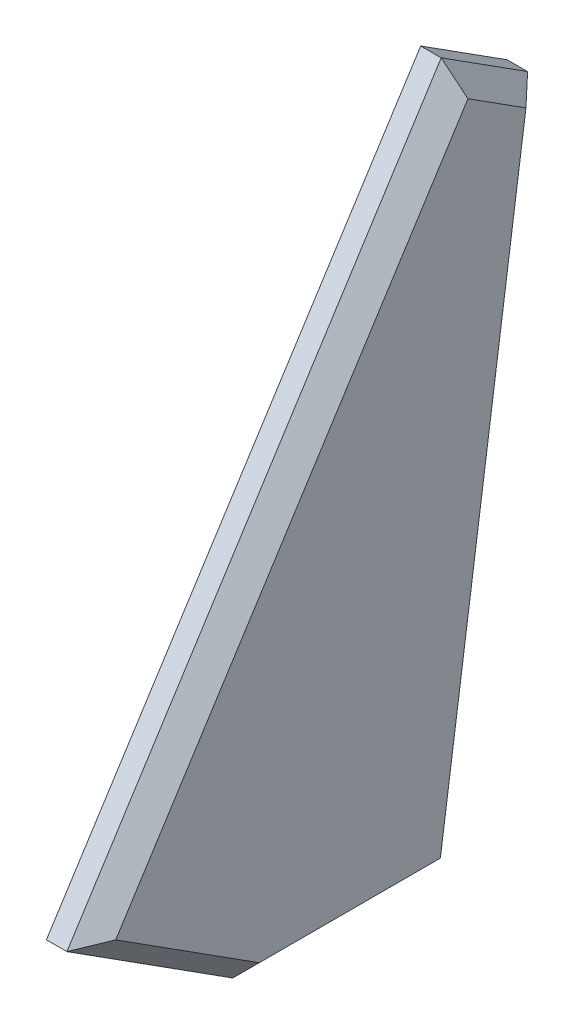
ISO-10303-21;
HEADER;
FILE_DESCRIPTION(('STEP AP214'),'2;1');
FILE_NAME('part.step','',(''),(''),'','','');
FILE_SCHEMA(('AUTOMOTIVE_DESIGN { 1 0 10303 214 1 1 1 1 }'));
ENDSEC;
DATA;
#1=APPLICATION_CONTEXT('core data for automotive mechanical design processes');
#2=APPLICATION_PROTOCOL_DEFINITION('international standard','automotive_design',2000,#1);
#3=PRODUCT_CONTEXT('',#1,'mechanical');
#4=PRODUCT('Part','Part','',(#3));
#5=PRODUCT_RELATED_PRODUCT_CATEGORY('part','',(#4));
#6=PRODUCT_DEFINITION_FORMATION('','',#4);
#7=PRODUCT_DEFINITION_CONTEXT('part definition',#1,'design');
#8=PRODUCT_DEFINITION('design','',#6,#7);
#9=PRODUCT_DEFINITION_SHAPE('','',#8);
#10=(LENGTH_UNIT() NAMED_UNIT(*) SI_UNIT(.MILLI.,.METRE.));
#11=(NAMED_UNIT(*) PLANE_ANGLE_UNIT() SI_UNIT($,.RADIAN.));
#12=(NAMED_UNIT(*) SI_UNIT($,.STERADIAN.) SOLID_ANGLE_UNIT());
#13=UNCERTAINTY_MEASURE_WITH_UNIT(LENGTH_MEASURE(1.E-05),#10,'distance_accuracy_value','');
#14=(GEOMETRIC_REPRESENTATION_CONTEXT(3) GLOBAL_UNCERTAINTY_ASSIGNED_CONTEXT((#13)) GLOBAL_UNIT_ASSIGNED_CONTEXT((#10,
#11,#12)) REPRESENTATION_CONTEXT('',''));
#15=CARTESIAN_POINT('',(0.,0.,0.));
#16=DIRECTION('',(0.,0.,1.));
#17=DIRECTION('',(1.,0.,0.));
#18=AXIS2_PLACEMENT_3D('',#15,#16,#17);
#19=CARTESIAN_POINT('',(10.,0.,0.));
#20=DIRECTION('',(-1.,0.,0.));
#21=DIRECTION('',(0.,0.,-1.));
#22=AXIS2_PLACEMENT_3D('',#19,#20,#21);
#23=PLANE('',#22);
#24=DIRECTION('',(0.,-0.537696320749716,-0.843138580929742));
#25=VECTOR('',#24,1.);
#26=CARTESIAN_POINT('',(10.,138.978102181345,-88.6307611795957));
#27=LINE('',#26,#25);
#28=CARTESIAN_POINT('',(10.,162.099043973583,-52.375802199617));
#29=VERTEX_POINT('',#28);
#30=CARTESIAN_POINT('',(10.,153.074407034999,-66.5269490238948));
#31=VERTEX_POINT('',#30);
#32=EDGE_CURVE('E58',#29,#31,#27,.T.);
#33=ORIENTED_EDGE('',*,*,#32,.F.);
#34=DIRECTION('',(0.,0.843138580929741,-0.537696320749717));
#35=VECTOR('',#34,1.);
#36=CARTESIAN_POINT('',(10.,23.1209417922378,36.2549589799789));
#37=LINE('',#36,#35);
#38=CARTESIAN_POINT('',(10.,27.3366346968866,33.5664773762303));
#39=VERTEX_POINT('',#38);
#40=EDGE_CURVE('E131',#39,#29,#37,.T.);
#41=ORIENTED_EDGE('',*,*,#40,.F.);
#42=DIRECTION('',(0.,0.537696320749717,0.843138580929741));
#43=VECTOR('',#42,1.);
#44=CARTESIAN_POINT('',(10.,4.21569290464871,-2.68848160374859));
#45=LINE('',#44,#43);
#46=CARTESIAN_POINT('',(10.,5.,-1.45864322496707));
#47=VERTEX_POINT('',#46);
#48=EDGE_CURVE('E129',#47,#39,#45,.T.);
#49=ORIENTED_EDGE('',*,*,#48,.F.);
#50=DIRECTION('',(0.,0.,1.));
#51=VECTOR('',#50,1.);
#52=CARTESIAN_POINT('',(10.,5.,0.));
#53=LINE('',#52,#51);
#54=CARTESIAN_POINT('',(10.,5.,-45.6454063089344));
#55=VERTEX_POINT('',#54);
#56=EDGE_CURVE('E105',#55,#47,#53,.T.);
#57=ORIENTED_EDGE('',*,*,#56,.F.);
#58=DIRECTION('',(0.,-0.990202485443901,0.139638955240722));
#59=VECTOR('',#58,1.);
#60=CARTESIAN_POINT('',(10.,-6.21393350821214,-44.0640106022536));
#61=LINE('',#60,#59);
#62=EDGE_CURVE('E12',#31,#55,#61,.T.);
#63=ORIENTED_EDGE('',*,*,#62,.F.);
#64=EDGE_LOOP('',(#33,#41,#49,#57,#63));
#65=FACE_BOUND('',#64,.T.);
#66=ADVANCED_FACE('F49',(#65),#23,.F.);
#67=CARTESIAN_POINT('',(5.,0.,0.));
#68=DIRECTION('',(-1.,0.,0.));
#69=DIRECTION('',(0.,0.,-1.));
#70=AXIS2_PLACEMENT_3D('',#67,#68,#69);
#71=PLANE('',#70);
#72=DIRECTION('',(0.,0.,1.));
#73=VECTOR('',#72,1.);
#74=CARTESIAN_POINT('',(5.,0.,-49.9897755536429));
#75=LINE('',#74,#73);
#76=CARTESIAN_POINT('',(5.,0.,-49.9897755536429));
#77=VERTEX_POINT('',#76);
#78=CARTESIAN_POINT('',(5.,0.,0.));
#79=VERTEX_POINT('',#78);
#80=EDGE_CURVE('E103',#77,#79,#75,.T.);
#81=ORIENTED_EDGE('',*,*,#80,.T.);
#82=DIRECTION('',(0.,0.537696320749717,0.843138580929741));
#83=VECTOR('',#82,1.);
#84=CARTESIAN_POINT('',(5.,0.,0.));
#85=LINE('',#84,#83);
#86=CARTESIAN_POINT('',(5.,25.8094233959864,40.4706518846276));
#87=VERTEX_POINT('',#86);
#88=EDGE_CURVE('E111',#79,#87,#85,.T.);
#89=ORIENTED_EDGE('',*,*,#88,.T.);
#90=DIRECTION('',(0.,0.843138580929741,-0.537696320749717));
#91=VECTOR('',#90,1.);
#92=CARTESIAN_POINT('',(5.,25.8094233959864,40.4706518846276));
#93=LINE('',#92,#91);
#94=CARTESIAN_POINT('',(5.,169.00321848198,-50.8485908987169));
#95=VERTEX_POINT('',#94);
#96=EDGE_CURVE('E116',#87,#95,#93,.T.);
#97=ORIENTED_EDGE('',*,*,#96,.T.);
#98=DIRECTION('',(0.,-0.537696320749716,-0.843138580929742));
#99=VECTOR('',#98,1.);
#100=CARTESIAN_POINT('',(5.,169.00321848198,-50.8485908987169));
#101=LINE('',#100,#99);
#102=CARTESIAN_POINT('',(5.,155.560810463237,-71.9270554219604));
#103=VERTEX_POINT('',#102);
#104=EDGE_CURVE('E125',#95,#103,#101,.T.);
#105=ORIENTED_EDGE('',*,*,#104,.T.);
#106=DIRECTION('',(0.,-0.990202485443901,0.139638955240722));
#107=VECTOR('',#106,1.);
#108=CARTESIAN_POINT('',(5.,155.560810463237,-71.9270554219604));
#109=LINE('',#108,#107);
#110=EDGE_CURVE('E121',#103,#77,#109,.T.);
#111=ORIENTED_EDGE('',*,*,#110,.T.);
#112=EDGE_LOOP('',(#81,#89,#97,#105,#111));
#113=FACE_BOUND('',#112,.T.);
#114=ADVANCED_FACE('F119',(#113),#71,.T.);
#115=CARTESIAN_POINT('',(10.,23.1209417922379,36.2549589799789));
#116=DIRECTION('',(-0.707106781186545,-0.380208714621183,-0.596189008055424));
#117=DIRECTION('',(0.,0.843138580929741,-0.537696320749717));
#118=AXIS2_PLACEMENT_3D('',#115,#116,#117);
#119=PLANE('',#118);
#120=DIRECTION('',(0.577350269189628,-0.797225402191064,-0.176347171136824));
#121=VECTOR('',#120,1.);
#122=CARTESIAN_POINT('',(64.9447446816678,86.2294228532693,-69.1582492001998));
#123=LINE('',#122,#121);
#124=EDGE_CURVE('E73',#29,#95,#123,.F.);
#125=ORIENTED_EDGE('',*,*,#124,.T.);
#126=ORIENTED_EDGE('',*,*,#96,.F.);
#127=DIRECTION('',(0.577350269189628,0.176347171136824,-0.797225402191064));
#128=VECTOR('',#127,1.);
#129=CARTESIAN_POINT('',(24.3333333333334,31.7146404261336,13.7745104521581));
#130=LINE('',#129,#128);
#131=EDGE_CURVE('E53',#87,#39,#130,.T.);
#132=ORIENTED_EDGE('',*,*,#131,.T.);
#133=ORIENTED_EDGE('',*,*,#40,.T.);
#134=EDGE_LOOP('',(#125,#126,#132,#133));
#135=FACE_BOUND('',#134,.T.);
#136=ADVANCED_FACE('F51',(#135),#119,.F.);
#137=CARTESIAN_POINT('',(10.,4.21569290464871,-2.68848160374859));
#138=DIRECTION('',(-0.707106781186545,0.596189008055424,-0.380208714621183));
#139=DIRECTION('',(0.,0.537696320749717,0.843138580929741));
#140=AXIS2_PLACEMENT_3D('',#137,#138,#139);
#141=PLANE('',#140);
#142=ORIENTED_EDGE('',*,*,#131,.F.);
#143=ORIENTED_EDGE('',*,*,#88,.F.);
#144=DIRECTION('',(0.69252582355833,0.692525823558326,-0.202029620129619));
#145=VECTOR('',#144,1.);
#146=CARTESIAN_POINT('',(9.79592016295141,4.79592016295141,-1.39910729063441));
#147=LINE('',#146,#145);
#148=EDGE_CURVE('E99',#79,#47,#147,.T.);
#149=ORIENTED_EDGE('',*,*,#148,.T.);
#150=ORIENTED_EDGE('',*,*,#48,.T.);
#151=EDGE_LOOP('',(#142,#143,#149,#150));
#152=FACE_BOUND('',#151,.T.);
#153=ADVANCED_FACE('F112',(#152),#141,.F.);
#154=CARTESIAN_POINT('',(10.,138.978102181345,-88.6307611795957));
#155=DIRECTION('',(-0.707106781186546,-0.596189008055424,0.380208714621182));
#156=DIRECTION('',(0.,-0.537696320749716,-0.843138580929742));
#157=AXIS2_PLACEMENT_3D('',#154,#155,#156);
#158=PLANE('',#157);
#159=ORIENTED_EDGE('',*,*,#124,.F.);
#160=ORIENTED_EDGE('',*,*,#32,.T.);
#161=DIRECTION('',(0.643658178645575,-0.320078780399511,0.695164529734237));
#162=VECTOR('',#161,1.);
#163=CARTESIAN_POINT('',(3.01382545322805,156.548496703671,-74.0721661975));
#164=LINE('',#163,#162);
#165=EDGE_CURVE('E65',#31,#103,#164,.F.);
#166=ORIENTED_EDGE('',*,*,#165,.T.);
#167=ORIENTED_EDGE('',*,*,#104,.F.);
#168=EDGE_LOOP('',(#159,#160,#166,#167));
#169=FACE_BOUND('',#168,.T.);
#170=ADVANCED_FACE('F139',(#169),#158,.F.);
#171=CARTESIAN_POINT('',(10.,5.,0.));
#172=DIRECTION('',(-0.707106781186545,0.707106781186549,0.));
#173=DIRECTION('',(0.,0.,1.));
#174=AXIS2_PLACEMENT_3D('',#171,#172,#173);
#175=PLANE('',#174);
#176=ORIENTED_EDGE('',*,*,#148,.F.);
#177=ORIENTED_EDGE('',*,*,#80,.F.);
#178=DIRECTION('',(-0.602481600728715,-0.602481600728712,-0.52348050734171));
#179=VECTOR('',#178,1.);
#180=CARTESIAN_POINT('',(24.3959848315547,19.3959848315546,-33.1371115590353));
#181=LINE('',#180,#179);
#182=EDGE_CURVE('E134',#77,#55,#181,.F.);
#183=ORIENTED_EDGE('',*,*,#182,.T.);
#184=ORIENTED_EDGE('',*,*,#56,.T.);
#185=EDGE_LOOP('',(#176,#177,#183,#184));
#186=FACE_BOUND('',#185,.T.);
#187=ADVANCED_FACE('F101',(#186),#175,.F.);
#188=CARTESIAN_POINT('',(10.,-6.21393350821214,-44.0640106022536));
#189=DIRECTION('',(-0.707106781186545,0.0987396521685198,0.700178892205159));
#190=DIRECTION('',(0.,-0.990202485443901,0.139638955240722));
#191=AXIS2_PLACEMENT_3D('',#188,#189,#190);
#192=PLANE('',#191);
#193=ORIENTED_EDGE('',*,*,#165,.F.);
#194=ORIENTED_EDGE('',*,*,#62,.T.);
#195=ORIENTED_EDGE('',*,*,#182,.F.);
#196=ORIENTED_EDGE('',*,*,#110,.F.);
#197=EDGE_LOOP('',(#193,#194,#195,#196));
#198=FACE_BOUND('',#197,.T.);
#199=ADVANCED_FACE('F140',(#198),#192,.F.);
#200=CLOSED_SHELL('',(#66,#114,#136,#153,#170,#187,#199));
#201=MANIFOLD_SOLID_BREP('B2',#200);
#202=CARTESIAN_POINT('',(5.,25.8094233959864,40.4706518846276));
#203=DIRECTION('',(0.,0.843138580929741,-0.537696320749717));
#204=DIRECTION('',(0.,-0.537696320749717,-0.843138580929741));
#205=AXIS2_PLACEMENT_3D('',#202,#203,#204);
#206=PLANE('',#205);
#207=DIRECTION('',(0.,0.537696320749717,0.843138580929741));
#208=VECTOR('',#207,1.);
#209=CARTESIAN_POINT('',(0.,25.8094233959864,40.4706518846276));
#210=LINE('',#209,#208);
#211=CARTESIAN_POINT('',(0.,0.,0.));
#212=VERTEX_POINT('',#211);
#213=CARTESIAN_POINT('',(0.,25.8094233959864,40.4706518846276));
#214=VERTEX_POINT('',#213);
#215=EDGE_CURVE('E274',#212,#214,#210,.T.);
#216=ORIENTED_EDGE('',*,*,#215,.F.);
#217=DIRECTION('',(-1.,0.,0.));
#218=VECTOR('',#217,1.);
#219=CARTESIAN_POINT('',(5.,0.,0.));
#220=LINE('',#219,#218);
#221=CARTESIAN_POINT('',(5.,0.,0.));
#222=VERTEX_POINT('',#221);
#223=EDGE_CURVE('E273',#222,#212,#220,.T.);
#224=ORIENTED_EDGE('',*,*,#223,.F.);
#225=DIRECTION('',(0.,0.537696320749717,0.843138580929741));
#226=VECTOR('',#225,1.);
#227=CARTESIAN_POINT('',(5.,25.8094233959864,40.4706518846276));
#228=LINE('',#227,#226);
#229=CARTESIAN_POINT('',(5.,25.8094233959864,40.4706518846276));
#230=VERTEX_POINT('',#229);
#231=EDGE_CURVE('E268',#222,#230,#228,.T.);
#232=ORIENTED_EDGE('',*,*,#231,.T.);
#233=DIRECTION('',(-1.,0.,0.));
#234=VECTOR('',#233,1.);
#235=CARTESIAN_POINT('',(5.,25.8094233959864,40.4706518846276));
#236=LINE('',#235,#234);
#237=EDGE_CURVE('E47',#230,#214,#236,.T.);
#238=ORIENTED_EDGE('',*,*,#237,.T.);
#239=EDGE_LOOP('',(#216,#224,#232,#238));
#240=FACE_BOUND('',#239,.T.);
#241=ADVANCED_FACE('F199',(#240),#206,.F.);
#242=CARTESIAN_POINT('',(5.,169.00321848198,-50.8485908987169));
#243=DIRECTION('',(0.,-0.537696320749717,-0.843138580929741));
#244=DIRECTION('',(0.,-0.843138580929741,0.537696320749717));
#245=AXIS2_PLACEMENT_3D('',#242,#243,#244);
#246=PLANE('',#245);
#247=DIRECTION('',(0.,0.843138580929741,-0.537696320749717));
#248=VECTOR('',#247,1.);
#249=CARTESIAN_POINT('',(0.,169.00321848198,-50.8485908987169));
#250=LINE('',#249,#248);
#251=CARTESIAN_POINT('',(0.,169.00321848198,-50.8485908987169));
#252=VERTEX_POINT('',#251);
#253=EDGE_CURVE('E276',#214,#252,#250,.T.);
#254=ORIENTED_EDGE('',*,*,#253,.F.);
#255=ORIENTED_EDGE('',*,*,#237,.F.);
#256=DIRECTION('',(0.,0.843138580929741,-0.537696320749717));
#257=VECTOR('',#256,1.);
#258=CARTESIAN_POINT('',(5.,169.00321848198,-50.8485908987169));
#259=LINE('',#258,#257);
#260=CARTESIAN_POINT('',(5.,169.00321848198,-50.8485908987169));
#261=VERTEX_POINT('',#260);
#262=EDGE_CURVE('E244',#230,#261,#259,.T.);
#263=ORIENTED_EDGE('',*,*,#262,.T.);
#264=DIRECTION('',(-1.,0.,0.));
#265=VECTOR('',#264,1.);
#266=CARTESIAN_POINT('',(5.,169.00321848198,-50.8485908987169));
#267=LINE('',#266,#265);
#268=EDGE_CURVE('E207',#261,#252,#267,.T.);
#269=ORIENTED_EDGE('',*,*,#268,.T.);
#270=EDGE_LOOP('',(#254,#255,#263,#269));
#271=FACE_BOUND('',#270,.T.);
#272=ADVANCED_FACE('F285',(#271),#246,.F.);
#273=CARTESIAN_POINT('',(5.,155.560810463237,-71.9270554219604));
#274=DIRECTION('',(0.,-0.843138580929742,0.537696320749716));
#275=DIRECTION('',(0.,0.537696320749716,0.843138580929742));
#276=AXIS2_PLACEMENT_3D('',#273,#274,#275);
#277=PLANE('',#276);
#278=DIRECTION('',(0.,-0.537696320749716,-0.843138580929742));
#279=VECTOR('',#278,1.);
#280=CARTESIAN_POINT('',(0.,155.560810463237,-71.9270554219604));
#281=LINE('',#280,#279);
#282=CARTESIAN_POINT('',(0.,155.560810463237,-71.9270554219604));
#283=VERTEX_POINT('',#282);
#284=EDGE_CURVE('E279',#252,#283,#281,.T.);
#285=ORIENTED_EDGE('',*,*,#284,.F.);
#286=ORIENTED_EDGE('',*,*,#268,.F.);
#287=DIRECTION('',(0.,-0.537696320749716,-0.843138580929742));
#288=VECTOR('',#287,1.);
#289=CARTESIAN_POINT('',(5.,155.560810463237,-71.9270554219604));
#290=LINE('',#289,#288);
#291=CARTESIAN_POINT('',(5.,155.560810463237,-71.9270554219604));
#292=VERTEX_POINT('',#291);
#293=EDGE_CURVE('E253',#261,#292,#290,.T.);
#294=ORIENTED_EDGE('',*,*,#293,.T.);
#295=DIRECTION('',(-1.,0.,0.));
#296=VECTOR('',#295,1.);
#297=CARTESIAN_POINT('',(5.,155.560810463237,-71.9270554219604));
#298=LINE('',#297,#296);
#299=EDGE_CURVE('E258',#292,#283,#298,.T.);
#300=ORIENTED_EDGE('',*,*,#299,.T.);
#301=EDGE_LOOP('',(#285,#286,#294,#300));
#302=FACE_BOUND('',#301,.T.);
#303=ADVANCED_FACE('F265',(#302),#277,.F.);
#304=CARTESIAN_POINT('',(5.,0.,-49.9897755536429));
#305=DIRECTION('',(0.,0.139638955240722,0.990202485443901));
#306=DIRECTION('',(0.,0.990202485443901,-0.139638955240722));
#307=AXIS2_PLACEMENT_3D('',#304,#305,#306);
#308=PLANE('',#307);
#309=DIRECTION('',(0.,-0.990202485443901,0.139638955240722));
#310=VECTOR('',#309,1.);
#311=CARTESIAN_POINT('',(0.,0.,-49.9897755536429));
#312=LINE('',#311,#310);
#313=CARTESIAN_POINT('',(0.,0.,-49.9897755536429));
#314=VERTEX_POINT('',#313);
#315=EDGE_CURVE('E260',#283,#314,#312,.T.);
#316=ORIENTED_EDGE('',*,*,#315,.F.);
#317=ORIENTED_EDGE('',*,*,#299,.F.);
#318=DIRECTION('',(0.,-0.990202485443901,0.139638955240722));
#319=VECTOR('',#318,1.);
#320=CARTESIAN_POINT('',(5.,0.,-49.9897755536429));
#321=LINE('',#320,#319);
#322=CARTESIAN_POINT('',(5.,0.,-49.9897755536429));
#323=VERTEX_POINT('',#322);
#324=EDGE_CURVE('E249',#292,#323,#321,.T.);
#325=ORIENTED_EDGE('',*,*,#324,.T.);
#326=DIRECTION('',(-1.,0.,0.));
#327=VECTOR('',#326,1.);
#328=CARTESIAN_POINT('',(5.,0.,-49.9897755536429));
#329=LINE('',#328,#327);
#330=EDGE_CURVE('E263',#323,#314,#329,.T.);
#331=ORIENTED_EDGE('',*,*,#330,.T.);
#332=EDGE_LOOP('',(#316,#317,#325,#331));
#333=FACE_BOUND('',#332,.T.);
#334=ADVANCED_FACE('F259',(#333),#308,.F.);
#335=CARTESIAN_POINT('',(5.,0.,0.));
#336=DIRECTION('',(0.,1.,0.));
#337=DIRECTION('',(0.,0.,-1.));
#338=AXIS2_PLACEMENT_3D('',#335,#336,#337);
#339=PLANE('',#338);
#340=DIRECTION('',(0.,0.,1.));
#341=VECTOR('',#340,1.);
#342=CARTESIAN_POINT('',(0.,0.,0.));
#343=LINE('',#342,#341);
#344=EDGE_CURVE('E232',#314,#212,#343,.T.);
#345=ORIENTED_EDGE('',*,*,#344,.F.);
#346=ORIENTED_EDGE('',*,*,#330,.F.);
#347=DIRECTION('',(0.,0.,1.));
#348=VECTOR('',#347,1.);
#349=CARTESIAN_POINT('',(5.,0.,0.));
#350=LINE('',#349,#348);
#351=EDGE_CURVE('E215',#323,#222,#350,.T.);
#352=ORIENTED_EDGE('',*,*,#351,.T.);
#353=ORIENTED_EDGE('',*,*,#223,.T.);
#354=EDGE_LOOP('',(#345,#346,#352,#353));
#355=FACE_BOUND('',#354,.T.);
#356=ADVANCED_FACE('F291',(#355),#339,.F.);
#357=CARTESIAN_POINT('',(5.,0.,0.));
#358=DIRECTION('',(1.,0.,0.));
#359=DIRECTION('',(0.,0.,1.));
#360=AXIS2_PLACEMENT_3D('',#357,#358,#359);
#361=PLANE('',#360);
#362=ORIENTED_EDGE('',*,*,#231,.F.);
#363=ORIENTED_EDGE('',*,*,#351,.F.);
#364=ORIENTED_EDGE('',*,*,#324,.F.);
#365=ORIENTED_EDGE('',*,*,#293,.F.);
#366=ORIENTED_EDGE('',*,*,#262,.F.);
#367=EDGE_LOOP('',(#362,#363,#364,#365,#366));
#368=FACE_BOUND('',#367,.T.);
#369=ADVANCED_FACE('F251',(#368),#361,.T.);
#370=CARTESIAN_POINT('',(0.,0.,0.));
#371=DIRECTION('',(1.,0.,0.));
#372=DIRECTION('',(0.,0.,1.));
#373=AXIS2_PLACEMENT_3D('',#370,#371,#372);
#374=PLANE('',#373);
#375=ORIENTED_EDGE('',*,*,#215,.T.);
#376=ORIENTED_EDGE('',*,*,#253,.T.);
#377=ORIENTED_EDGE('',*,*,#284,.T.);
#378=ORIENTED_EDGE('',*,*,#315,.T.);
#379=ORIENTED_EDGE('',*,*,#344,.T.);
#380=EDGE_LOOP('',(#375,#376,#377,#378,#379));
#381=FACE_BOUND('',#380,.T.);
#382=ADVANCED_FACE('F286',(#381),#374,.F.);
#383=CLOSED_SHELL('',(#241,#272,#303,#334,#356,#369,#382));
#384=MANIFOLD_SOLID_BREP('B6',#383);
#385=ADVANCED_BREP_SHAPE_REPRESENTATION('',(#18,#201,#384),#14);
#386=SHAPE_DEFINITION_REPRESENTATION(#9,#385);
ENDSEC;
END-ISO-10303-21;
